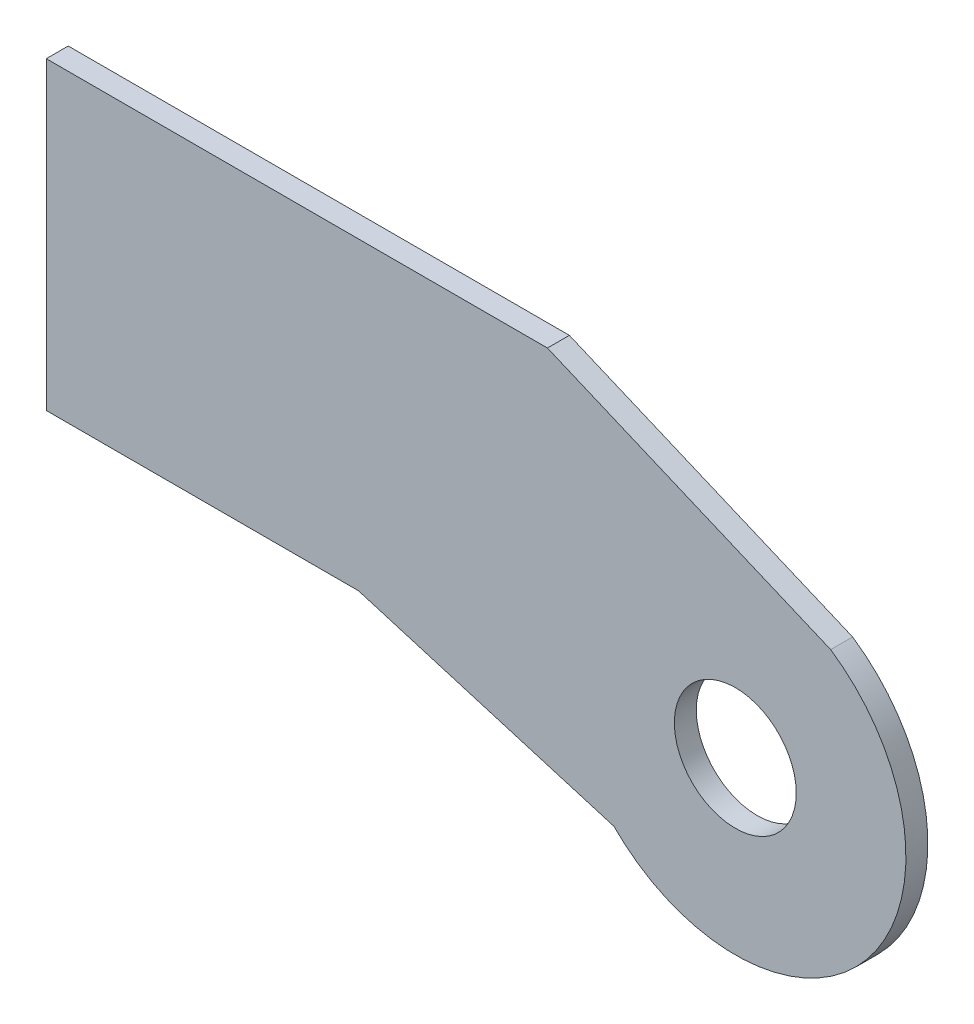
ISO-10303-21;
HEADER;
FILE_DESCRIPTION(('STEP AP214'),'2;1');
FILE_NAME('part.step','',(''),(''),'','','');
FILE_SCHEMA(('AUTOMOTIVE_DESIGN { 1 0 10303 214 1 1 1 1 }'));
ENDSEC;
DATA;
#1=APPLICATION_CONTEXT('core data for automotive mechanical design processes');
#2=APPLICATION_PROTOCOL_DEFINITION('international standard','automotive_design',2000,#1);
#3=PRODUCT_CONTEXT('',#1,'mechanical');
#4=PRODUCT('Part','Part','',(#3));
#5=PRODUCT_RELATED_PRODUCT_CATEGORY('part','',(#4));
#6=PRODUCT_DEFINITION_FORMATION('','',#4);
#7=PRODUCT_DEFINITION_CONTEXT('part definition',#1,'design');
#8=PRODUCT_DEFINITION('design','',#6,#7);
#9=PRODUCT_DEFINITION_SHAPE('','',#8);
#10=(LENGTH_UNIT() NAMED_UNIT(*) SI_UNIT(.MILLI.,.METRE.));
#11=(NAMED_UNIT(*) PLANE_ANGLE_UNIT() SI_UNIT($,.RADIAN.));
#12=(NAMED_UNIT(*) SI_UNIT($,.STERADIAN.) SOLID_ANGLE_UNIT());
#13=UNCERTAINTY_MEASURE_WITH_UNIT(LENGTH_MEASURE(1.E-05),#10,'distance_accuracy_value','');
#14=(GEOMETRIC_REPRESENTATION_CONTEXT(3) GLOBAL_UNCERTAINTY_ASSIGNED_CONTEXT((#13)) GLOBAL_UNIT_ASSIGNED_CONTEXT((#10,
#11,#12)) REPRESENTATION_CONTEXT('',''));
#15=CARTESIAN_POINT('',(0.,0.,0.));
#16=DIRECTION('',(0.,0.,1.));
#17=DIRECTION('',(1.,0.,0.));
#18=AXIS2_PLACEMENT_3D('',#15,#16,#17);
#19=CARTESIAN_POINT('',(9.82819452457424,-9.59465018072124,1.8));
#20=DIRECTION('',(0.286043449843738,0.958216648155047,0.));
#21=DIRECTION('',(-0.958216648155047,0.286043449843738,0.));
#22=AXIS2_PLACEMENT_3D('',#19,#20,#21);
#23=PLANE('',#22);
#24=DIRECTION('',(0.958216648155047,-0.286043449843738,0.));
#25=VECTOR('',#24,1.);
#26=CARTESIAN_POINT('',(9.82819452457424,-9.59465018072124,0.));
#27=LINE('',#26,#25);
#28=CARTESIAN_POINT('',(9.82819452457424,-9.59465018072124,0.));
#29=VERTEX_POINT('',#28);
#30=CARTESIAN_POINT('',(30.7909488806224,-15.8523775806533,0.));
#31=VERTEX_POINT('',#30);
#32=EDGE_CURVE('E129',#29,#31,#27,.T.);
#33=ORIENTED_EDGE('',*,*,#32,.T.);
#34=DIRECTION('',(0.,0.,-1.));
#35=VECTOR('',#34,1.);
#36=CARTESIAN_POINT('',(30.7909488806224,-15.8523775806533,1.8));
#37=LINE('',#36,#35);
#38=CARTESIAN_POINT('',(30.7909488806224,-15.8523775806533,1.8));
#39=VERTEX_POINT('',#38);
#40=EDGE_CURVE('E11',#39,#31,#37,.T.);
#41=ORIENTED_EDGE('',*,*,#40,.F.);
#42=DIRECTION('',(0.958216648155047,-0.286043449843738,0.));
#43=VECTOR('',#42,1.);
#44=CARTESIAN_POINT('',(9.82819452457424,-9.59465018072124,1.8));
#45=LINE('',#44,#43);
#46=CARTESIAN_POINT('',(9.82819452457424,-9.59465018072124,1.8));
#47=VERTEX_POINT('',#46);
#48=EDGE_CURVE('E145',#47,#39,#45,.T.);
#49=ORIENTED_EDGE('',*,*,#48,.F.);
#50=DIRECTION('',(0.,0.,-1.));
#51=VECTOR('',#50,1.);
#52=CARTESIAN_POINT('',(9.82819452457424,-9.59465018072124,1.8));
#53=LINE('',#52,#51);
#54=EDGE_CURVE('E125',#47,#29,#53,.T.);
#55=ORIENTED_EDGE('',*,*,#54,.T.);
#56=EDGE_LOOP('',(#33,#41,#49,#55));
#57=FACE_BOUND('',#56,.T.);
#58=ADVANCED_FACE('F39',(#57),#23,.F.);
#59=CARTESIAN_POINT('',(40.750876667059,-6.01368668760413,1.8));
#60=DIRECTION('',(0.,0.,-1.));
#61=DIRECTION('',(-1.,0.,0.));
#62=AXIS2_PLACEMENT_3D('',#59,#60,#61);
#63=CYLINDRICAL_SURFACE('',#62,14.);
#64=CARTESIAN_POINT('',(40.750876667059,-6.01368668760413,0.));
#65=DIRECTION('',(0.,0.,1.));
#66=DIRECTION('',(-1.,0.,0.));
#67=AXIS2_PLACEMENT_3D('',#64,#65,#66);
#68=CIRCLE('',#67,14.);
#69=CARTESIAN_POINT('',(48.5752132437924,5.59578173838296,0.));
#70=VERTEX_POINT('',#69);
#71=EDGE_CURVE('E133',#31,#70,#68,.T.);
#72=ORIENTED_EDGE('',*,*,#71,.T.);
#73=DIRECTION('',(0.,0.,-1.));
#74=VECTOR('',#73,1.);
#75=CARTESIAN_POINT('',(48.5752132437924,5.59578173838296,1.8));
#76=LINE('',#75,#74);
#77=CARTESIAN_POINT('',(48.5752132437924,5.59578173838296,1.8));
#78=VERTEX_POINT('',#77);
#79=EDGE_CURVE('E49',#78,#70,#76,.T.);
#80=ORIENTED_EDGE('',*,*,#79,.F.);
#81=CARTESIAN_POINT('',(40.750876667059,-6.01368668760413,1.8));
#82=DIRECTION('',(0.,0.,1.));
#83=DIRECTION('',(-1.,0.,0.));
#84=AXIS2_PLACEMENT_3D('',#81,#82,#83);
#85=CIRCLE('',#84,14.);
#86=EDGE_CURVE('E94',#39,#78,#85,.T.);
#87=ORIENTED_EDGE('',*,*,#86,.F.);
#88=ORIENTED_EDGE('',*,*,#40,.T.);
#89=EDGE_LOOP('',(#72,#80,#87,#88));
#90=FACE_BOUND('',#89,.T.);
#91=ADVANCED_FACE('F175',(#90),#63,.T.);
#92=CARTESIAN_POINT('',(25.3371978494615,15.4053498192788,1.8));
#93=DIRECTION('',(-0.388903449256946,-0.921278517689439,0.));
#94=DIRECTION('',(0.921278517689439,-0.388903449256946,0.));
#95=AXIS2_PLACEMENT_3D('',#92,#93,#94);
#96=PLANE('',#95);
#97=DIRECTION('',(-0.921278517689439,0.388903449256946,0.));
#98=VECTOR('',#97,1.);
#99=CARTESIAN_POINT('',(25.3371978494615,15.4053498192788,0.));
#100=LINE('',#99,#98);
#101=CARTESIAN_POINT('',(25.3371978494615,15.4053498192788,0.));
#102=VERTEX_POINT('',#101);
#103=EDGE_CURVE('E136',#70,#102,#100,.T.);
#104=ORIENTED_EDGE('',*,*,#103,.T.);
#105=DIRECTION('',(0.,0.,-1.));
#106=VECTOR('',#105,1.);
#107=CARTESIAN_POINT('',(25.3371978494615,15.4053498192788,1.8));
#108=LINE('',#107,#106);
#109=CARTESIAN_POINT('',(25.3371978494615,15.4053498192788,1.8));
#110=VERTEX_POINT('',#109);
#111=EDGE_CURVE('E118',#110,#102,#108,.T.);
#112=ORIENTED_EDGE('',*,*,#111,.F.);
#113=DIRECTION('',(-0.921278517689439,0.388903449256946,0.));
#114=VECTOR('',#113,1.);
#115=CARTESIAN_POINT('',(25.3371978494615,15.4053498192788,1.8));
#116=LINE('',#115,#114);
#117=EDGE_CURVE('E107',#78,#110,#116,.T.);
#118=ORIENTED_EDGE('',*,*,#117,.F.);
#119=ORIENTED_EDGE('',*,*,#79,.T.);
#120=EDGE_LOOP('',(#104,#112,#118,#119));
#121=FACE_BOUND('',#120,.T.);
#122=ADVANCED_FACE('F156',(#121),#96,.F.);
#123=CARTESIAN_POINT('',(-15.7803329867317,15.4053498192788,1.8));
#124=DIRECTION('',(0.,-1.,0.));
#125=DIRECTION('',(0.,0.,-1.));
#126=AXIS2_PLACEMENT_3D('',#123,#124,#125);
#127=PLANE('',#126);
#128=DIRECTION('',(-1.,0.,0.));
#129=VECTOR('',#128,1.);
#130=CARTESIAN_POINT('',(-15.7803329867317,15.4053498192788,0.));
#131=LINE('',#130,#129);
#132=CARTESIAN_POINT('',(-15.7803329867317,15.4053498192788,0.));
#133=VERTEX_POINT('',#132);
#134=EDGE_CURVE('E116',#102,#133,#131,.T.);
#135=ORIENTED_EDGE('',*,*,#134,.T.);
#136=DIRECTION('',(0.,0.,-1.));
#137=VECTOR('',#136,1.);
#138=CARTESIAN_POINT('',(-15.7803329867317,15.4053498192788,1.8));
#139=LINE('',#138,#137);
#140=CARTESIAN_POINT('',(-15.7803329867317,15.4053498192788,1.8));
#141=VERTEX_POINT('',#140);
#142=EDGE_CURVE('E113',#141,#133,#139,.T.);
#143=ORIENTED_EDGE('',*,*,#142,.F.);
#144=DIRECTION('',(-1.,0.,0.));
#145=VECTOR('',#144,1.);
#146=CARTESIAN_POINT('',(-15.7803329867317,15.4053498192788,1.8));
#147=LINE('',#146,#145);
#148=EDGE_CURVE('E101',#110,#141,#147,.T.);
#149=ORIENTED_EDGE('',*,*,#148,.F.);
#150=ORIENTED_EDGE('',*,*,#111,.T.);
#151=EDGE_LOOP('',(#135,#143,#149,#150));
#152=FACE_BOUND('',#151,.T.);
#153=ADVANCED_FACE('F114',(#152),#127,.F.);
#154=CARTESIAN_POINT('',(-15.7803329867317,15.4053498192788,1.8));
#155=DIRECTION('',(1.,0.,0.));
#156=DIRECTION('',(0.,0.,-1.));
#157=AXIS2_PLACEMENT_3D('',#154,#155,#156);
#158=PLANE('',#157);
#159=DIRECTION('',(0.,-1.,0.));
#160=VECTOR('',#159,1.);
#161=CARTESIAN_POINT('',(-15.7803329867317,15.4053498192788,0.));
#162=LINE('',#161,#160);
#163=CARTESIAN_POINT('',(-15.7803329867317,-9.59465018072123,0.));
#164=VERTEX_POINT('',#163);
#165=EDGE_CURVE('E80',#133,#164,#162,.T.);
#166=ORIENTED_EDGE('',*,*,#165,.T.);
#167=DIRECTION('',(0.,0.,-1.));
#168=VECTOR('',#167,1.);
#169=CARTESIAN_POINT('',(-15.7803329867317,-9.59465018072123,1.8));
#170=LINE('',#169,#168);
#171=CARTESIAN_POINT('',(-15.7803329867317,-9.59465018072123,1.8));
#172=VERTEX_POINT('',#171);
#173=EDGE_CURVE('E119',#172,#164,#170,.T.);
#174=ORIENTED_EDGE('',*,*,#173,.F.);
#175=DIRECTION('',(0.,-1.,0.));
#176=VECTOR('',#175,1.);
#177=CARTESIAN_POINT('',(-15.7803329867317,15.4053498192788,1.8));
#178=LINE('',#177,#176);
#179=EDGE_CURVE('E105',#141,#172,#178,.T.);
#180=ORIENTED_EDGE('',*,*,#179,.F.);
#181=ORIENTED_EDGE('',*,*,#142,.T.);
#182=EDGE_LOOP('',(#166,#174,#180,#181));
#183=FACE_BOUND('',#182,.T.);
#184=ADVANCED_FACE('F121',(#183),#158,.F.);
#185=CARTESIAN_POINT('',(-15.7803329867317,-9.59465018072123,1.8));
#186=DIRECTION('',(0.,1.,0.));
#187=DIRECTION('',(-1.,0.,0.));
#188=AXIS2_PLACEMENT_3D('',#185,#186,#187);
#189=PLANE('',#188);
#190=DIRECTION('',(1.,0.,0.));
#191=VECTOR('',#190,1.);
#192=CARTESIAN_POINT('',(-15.7803329867317,-9.59465018072123,0.));
#193=LINE('',#192,#191);
#194=EDGE_CURVE('E86',#164,#29,#193,.T.);
#195=ORIENTED_EDGE('',*,*,#194,.T.);
#196=ORIENTED_EDGE('',*,*,#54,.F.);
#197=DIRECTION('',(1.,0.,0.));
#198=VECTOR('',#197,1.);
#199=CARTESIAN_POINT('',(-15.7803329867317,-9.59465018072123,1.8));
#200=LINE('',#199,#198);
#201=EDGE_CURVE('E57',#172,#47,#200,.T.);
#202=ORIENTED_EDGE('',*,*,#201,.F.);
#203=ORIENTED_EDGE('',*,*,#173,.T.);
#204=EDGE_LOOP('',(#195,#196,#202,#203));
#205=FACE_BOUND('',#204,.T.);
#206=ADVANCED_FACE('F163',(#205),#189,.F.);
#207=CARTESIAN_POINT('',(40.750876667059,-6.01368668760413,1.8));
#208=DIRECTION('',(0.,0.,-1.));
#209=DIRECTION('',(-1.,0.,0.));
#210=AXIS2_PLACEMENT_3D('',#207,#208,#209);
#211=PLANE('',#210);
#212=CARTESIAN_POINT('',(40.750876667059,-6.01368668760413,1.8));
#213=DIRECTION('',(0.,0.,1.));
#214=DIRECTION('',(1.,0.,0.));
#215=AXIS2_PLACEMENT_3D('',#212,#213,#214);
#216=CIRCLE('',#215,5.);
#217=CARTESIAN_POINT('',(45.750876667059,-6.01368668760413,1.8));
#218=VERTEX_POINT('',#217);
#219=EDGE_CURVE('E230',#218,#218,#216,.T.);
#220=ORIENTED_EDGE('',*,*,#219,.F.);
#221=EDGE_LOOP('',(#220));
#222=FACE_BOUND('',#221,.T.);
#223=ORIENTED_EDGE('',*,*,#48,.T.);
#224=ORIENTED_EDGE('',*,*,#86,.T.);
#225=ORIENTED_EDGE('',*,*,#117,.T.);
#226=ORIENTED_EDGE('',*,*,#148,.T.);
#227=ORIENTED_EDGE('',*,*,#179,.T.);
#228=ORIENTED_EDGE('',*,*,#201,.T.);
#229=EDGE_LOOP('',(#223,#224,#225,#226,#227,#228));
#230=FACE_BOUND('',#229,.T.);
#231=ADVANCED_FACE('F103',(#222,#230),#211,.F.);
#232=CARTESIAN_POINT('',(40.750876667059,-6.01368668760413,0.));
#233=DIRECTION('',(0.,0.,-1.));
#234=DIRECTION('',(-1.,0.,0.));
#235=AXIS2_PLACEMENT_3D('',#232,#233,#234);
#236=PLANE('',#235);
#237=CARTESIAN_POINT('',(40.750876667059,-6.01368668760413,0.));
#238=DIRECTION('',(0.,0.,-1.));
#239=DIRECTION('',(-1.,0.,0.));
#240=AXIS2_PLACEMENT_3D('',#237,#238,#239);
#241=CIRCLE('',#240,5.);
#242=CARTESIAN_POINT('',(35.750876667059,-6.01368668760413,0.));
#243=VERTEX_POINT('',#242);
#244=EDGE_CURVE('E42',#243,#243,#241,.T.);
#245=ORIENTED_EDGE('',*,*,#244,.F.);
#246=EDGE_LOOP('',(#245));
#247=FACE_BOUND('',#246,.T.);
#248=ORIENTED_EDGE('',*,*,#32,.F.);
#249=ORIENTED_EDGE('',*,*,#194,.F.);
#250=ORIENTED_EDGE('',*,*,#165,.F.);
#251=ORIENTED_EDGE('',*,*,#134,.F.);
#252=ORIENTED_EDGE('',*,*,#103,.F.);
#253=ORIENTED_EDGE('',*,*,#71,.F.);
#254=EDGE_LOOP('',(#248,#249,#250,#251,#252,#253));
#255=FACE_BOUND('',#254,.T.);
#256=ADVANCED_FACE('F159',(#247,#255),#236,.T.);
#257=CARTESIAN_POINT('',(40.750876667059,-6.01368668760413,-1.2));
#258=DIRECTION('',(0.,0.,1.));
#259=DIRECTION('',(1.,0.,0.));
#260=AXIS2_PLACEMENT_3D('',#257,#258,#259);
#261=CYLINDRICAL_SURFACE('',#260,5.);
#262=ORIENTED_EDGE('',*,*,#244,.T.);
#263=EDGE_LOOP('',(#262));
#264=FACE_BOUND('',#263,.T.);
#265=ORIENTED_EDGE('',*,*,#219,.T.);
#266=EDGE_LOOP('',(#265));
#267=FACE_BOUND('',#266,.T.);
#268=ADVANCED_FACE('F212',(#264,#267),#261,.F.);
#269=CLOSED_SHELL('',(#58,#91,#122,#153,#184,#206,#231,#256,#268));
#270=MANIFOLD_SOLID_BREP('B2',#269);
#271=ADVANCED_BREP_SHAPE_REPRESENTATION('',(#18,#270),#14);
#272=SHAPE_DEFINITION_REPRESENTATION(#9,#271);
ENDSEC;
END-ISO-10303-21;
